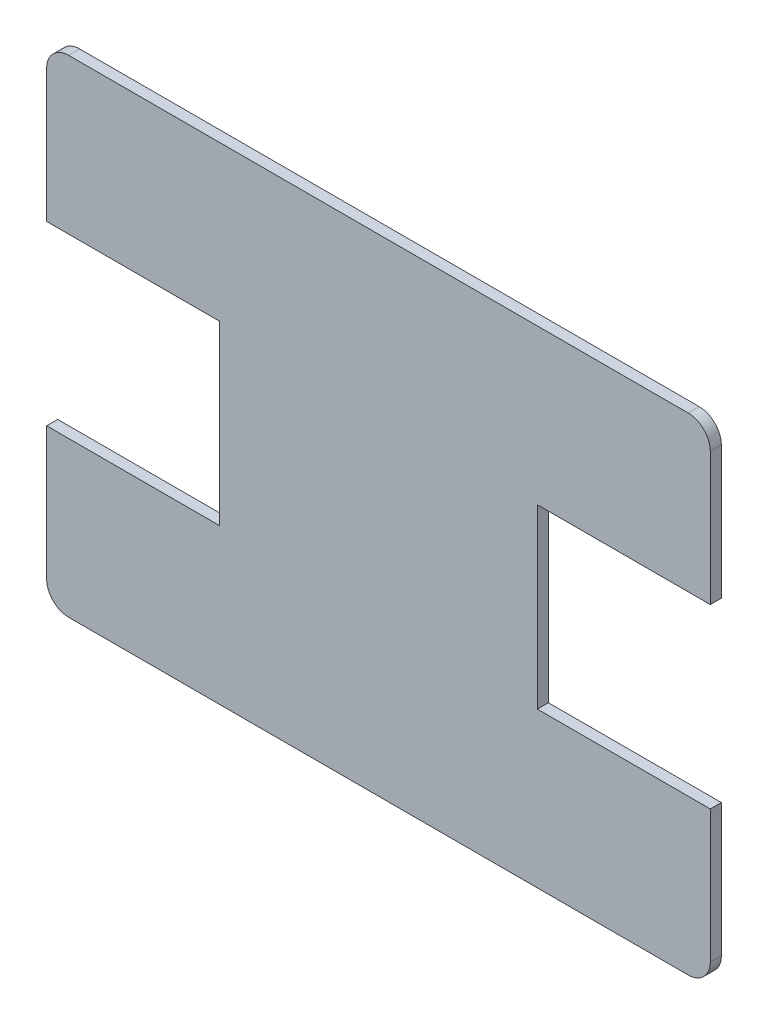
ISO-10303-21;
HEADER;
FILE_DESCRIPTION(('STEP AP214'),'2;1');
FILE_NAME('part.step','',(''),(''),'','','');
FILE_SCHEMA(('AUTOMOTIVE_DESIGN { 1 0 10303 214 1 1 1 1 }'));
ENDSEC;
DATA;
#1=APPLICATION_CONTEXT('core data for automotive mechanical design processes');
#2=APPLICATION_PROTOCOL_DEFINITION('international standard','automotive_design',2000,#1);
#3=PRODUCT_CONTEXT('',#1,'mechanical');
#4=PRODUCT('Part','Part','',(#3));
#5=PRODUCT_RELATED_PRODUCT_CATEGORY('part','',(#4));
#6=PRODUCT_DEFINITION_FORMATION('','',#4);
#7=PRODUCT_DEFINITION_CONTEXT('part definition',#1,'design');
#8=PRODUCT_DEFINITION('design','',#6,#7);
#9=PRODUCT_DEFINITION_SHAPE('','',#8);
#10=(LENGTH_UNIT() NAMED_UNIT(*) SI_UNIT(.MILLI.,.METRE.));
#11=(NAMED_UNIT(*) PLANE_ANGLE_UNIT() SI_UNIT($,.RADIAN.));
#12=(NAMED_UNIT(*) SI_UNIT($,.STERADIAN.) SOLID_ANGLE_UNIT());
#13=UNCERTAINTY_MEASURE_WITH_UNIT(LENGTH_MEASURE(1.E-05),#10,'distance_accuracy_value','');
#14=(GEOMETRIC_REPRESENTATION_CONTEXT(3) GLOBAL_UNCERTAINTY_ASSIGNED_CONTEXT((#13)) GLOBAL_UNIT_ASSIGNED_CONTEXT((#10,
#11,#12)) REPRESENTATION_CONTEXT('',''));
#15=CARTESIAN_POINT('',(0.,0.,0.));
#16=DIRECTION('',(0.,0.,1.));
#17=DIRECTION('',(1.,0.,0.));
#18=AXIS2_PLACEMENT_3D('',#15,#16,#17);
#19=CARTESIAN_POINT('',(-150.,99.9999999999999,5.));
#20=DIRECTION('',(1.,0.,0.));
#21=DIRECTION('',(0.,0.,-1.));
#22=AXIS2_PLACEMENT_3D('',#19,#20,#21);
#23=PLANE('',#22);
#24=DIRECTION('',(0.,-1.,0.));
#25=VECTOR('',#24,1.);
#26=CARTESIAN_POINT('',(-150.,99.9999999999999,0.));
#27=LINE('',#26,#25);
#28=CARTESIAN_POINT('',(-150.,99.9999999999999,0.));
#29=VERTEX_POINT('',#28);
#30=CARTESIAN_POINT('',(-150.,40.,0.));
#31=VERTEX_POINT('',#30);
#32=EDGE_CURVE('E179',#29,#31,#27,.T.);
#33=ORIENTED_EDGE('',*,*,#32,.T.);
#34=DIRECTION('',(0.,0.,-1.));
#35=VECTOR('',#34,1.);
#36=CARTESIAN_POINT('',(-150.,40.,5.));
#37=LINE('',#36,#35);
#38=CARTESIAN_POINT('',(-150.,40.,5.));
#39=VERTEX_POINT('',#38);
#40=EDGE_CURVE('E11',#39,#31,#37,.T.);
#41=ORIENTED_EDGE('',*,*,#40,.F.);
#42=DIRECTION('',(0.,-1.,0.));
#43=VECTOR('',#42,1.);
#44=CARTESIAN_POINT('',(-150.,99.9999999999999,5.));
#45=LINE('',#44,#43);
#46=CARTESIAN_POINT('',(-150.,99.9999999999999,5.));
#47=VERTEX_POINT('',#46);
#48=EDGE_CURVE('E209',#47,#39,#45,.T.);
#49=ORIENTED_EDGE('',*,*,#48,.F.);
#50=DIRECTION('',(0.,0.,-1.));
#51=VECTOR('',#50,1.);
#52=CARTESIAN_POINT('',(-150.,99.9999999999999,5.));
#53=LINE('',#52,#51);
#54=EDGE_CURVE('E175',#47,#29,#53,.T.);
#55=ORIENTED_EDGE('',*,*,#54,.T.);
#56=EDGE_LOOP('',(#33,#41,#49,#55));
#57=FACE_BOUND('',#56,.T.);
#58=ADVANCED_FACE('F35',(#57),#23,.F.);
#59=CARTESIAN_POINT('',(-150.,40.,5.));
#60=DIRECTION('',(0.,1.,0.));
#61=DIRECTION('',(-1.,0.,0.));
#62=AXIS2_PLACEMENT_3D('',#59,#60,#61);
#63=PLANE('',#62);
#64=DIRECTION('',(1.,0.,0.));
#65=VECTOR('',#64,1.);
#66=CARTESIAN_POINT('',(-150.,40.,0.));
#67=LINE('',#66,#65);
#68=CARTESIAN_POINT('',(-71.83,40.,0.));
#69=VERTEX_POINT('',#68);
#70=EDGE_CURVE('E182',#31,#69,#67,.T.);
#71=ORIENTED_EDGE('',*,*,#70,.T.);
#72=DIRECTION('',(0.,0.,-1.));
#73=VECTOR('',#72,1.);
#74=CARTESIAN_POINT('',(-71.83,40.,5.));
#75=LINE('',#74,#73);
#76=CARTESIAN_POINT('',(-71.83,40.,5.));
#77=VERTEX_POINT('',#76);
#78=EDGE_CURVE('E43',#77,#69,#75,.T.);
#79=ORIENTED_EDGE('',*,*,#78,.F.);
#80=DIRECTION('',(1.,0.,0.));
#81=VECTOR('',#80,1.);
#82=CARTESIAN_POINT('',(-150.,40.,5.));
#83=LINE('',#82,#81);
#84=EDGE_CURVE('E118',#39,#77,#83,.T.);
#85=ORIENTED_EDGE('',*,*,#84,.F.);
#86=ORIENTED_EDGE('',*,*,#40,.T.);
#87=EDGE_LOOP('',(#71,#79,#85,#86));
#88=FACE_BOUND('',#87,.T.);
#89=ADVANCED_FACE('F307',(#88),#63,.F.);
#90=CARTESIAN_POINT('',(-71.83,40.,5.));
#91=DIRECTION('',(1.,0.,0.));
#92=DIRECTION('',(0.,1.,0.));
#93=AXIS2_PLACEMENT_3D('',#90,#91,#92);
#94=PLANE('',#93);
#95=DIRECTION('',(0.,-1.,0.));
#96=VECTOR('',#95,1.);
#97=CARTESIAN_POINT('',(-71.83,40.,0.));
#98=LINE('',#97,#96);
#99=CARTESIAN_POINT('',(-71.83,-40.,0.));
#100=VERTEX_POINT('',#99);
#101=EDGE_CURVE('E184',#69,#100,#98,.T.);
#102=ORIENTED_EDGE('',*,*,#101,.T.);
#103=DIRECTION('',(0.,0.,-1.));
#104=VECTOR('',#103,1.);
#105=CARTESIAN_POINT('',(-71.83,-40.,5.));
#106=LINE('',#105,#104);
#107=CARTESIAN_POINT('',(-71.83,-40.,5.));
#108=VERTEX_POINT('',#107);
#109=EDGE_CURVE('E240',#108,#100,#106,.T.);
#110=ORIENTED_EDGE('',*,*,#109,.F.);
#111=DIRECTION('',(0.,-1.,0.));
#112=VECTOR('',#111,1.);
#113=CARTESIAN_POINT('',(-71.83,40.,5.));
#114=LINE('',#113,#112);
#115=EDGE_CURVE('E248',#77,#108,#114,.T.);
#116=ORIENTED_EDGE('',*,*,#115,.F.);
#117=ORIENTED_EDGE('',*,*,#78,.T.);
#118=EDGE_LOOP('',(#102,#110,#116,#117));
#119=FACE_BOUND('',#118,.T.);
#120=ADVANCED_FACE('F246',(#119),#94,.F.);
#121=CARTESIAN_POINT('',(-71.83,-40.,5.));
#122=DIRECTION('',(0.,-1.,0.));
#123=DIRECTION('',(1.,0.,0.));
#124=AXIS2_PLACEMENT_3D('',#121,#122,#123);
#125=PLANE('',#124);
#126=DIRECTION('',(-1.,0.,0.));
#127=VECTOR('',#126,1.);
#128=CARTESIAN_POINT('',(-71.83,-40.,0.));
#129=LINE('',#128,#127);
#130=CARTESIAN_POINT('',(-150.,-40.0000000000001,0.));
#131=VERTEX_POINT('',#130);
#132=EDGE_CURVE('E186',#100,#131,#129,.T.);
#133=ORIENTED_EDGE('',*,*,#132,.T.);
#134=DIRECTION('',(0.,0.,-1.));
#135=VECTOR('',#134,1.);
#136=CARTESIAN_POINT('',(-150.,-40.0000000000001,5.));
#137=LINE('',#136,#135);
#138=CARTESIAN_POINT('',(-150.,-40.0000000000001,5.));
#139=VERTEX_POINT('',#138);
#140=EDGE_CURVE('E237',#139,#131,#137,.T.);
#141=ORIENTED_EDGE('',*,*,#140,.F.);
#142=DIRECTION('',(-1.,0.,0.));
#143=VECTOR('',#142,1.);
#144=CARTESIAN_POINT('',(-71.83,-40.,5.));
#145=LINE('',#144,#143);
#146=EDGE_CURVE('E266',#108,#139,#145,.T.);
#147=ORIENTED_EDGE('',*,*,#146,.F.);
#148=ORIENTED_EDGE('',*,*,#109,.T.);
#149=EDGE_LOOP('',(#133,#141,#147,#148));
#150=FACE_BOUND('',#149,.T.);
#151=ADVANCED_FACE('F257',(#150),#125,.F.);
#152=CARTESIAN_POINT('',(-150.,-40.0000000000001,5.));
#153=DIRECTION('',(1.,0.,0.));
#154=DIRECTION('',(0.,1.,0.));
#155=AXIS2_PLACEMENT_3D('',#152,#153,#154);
#156=PLANE('',#155);
#157=DIRECTION('',(0.,-1.,0.));
#158=VECTOR('',#157,1.);
#159=CARTESIAN_POINT('',(-150.,-40.0000000000001,0.));
#160=LINE('',#159,#158);
#161=CARTESIAN_POINT('',(-150.,-100.,0.));
#162=VERTEX_POINT('',#161);
#163=EDGE_CURVE('E188',#131,#162,#160,.T.);
#164=ORIENTED_EDGE('',*,*,#163,.T.);
#165=DIRECTION('',(0.,0.,-1.));
#166=VECTOR('',#165,1.);
#167=CARTESIAN_POINT('',(-150.,-100.,5.));
#168=LINE('',#167,#166);
#169=CARTESIAN_POINT('',(-150.,-100.,5.));
#170=VERTEX_POINT('',#169);
#171=EDGE_CURVE('E234',#170,#162,#168,.T.);
#172=ORIENTED_EDGE('',*,*,#171,.F.);
#173=DIRECTION('',(0.,-1.,0.));
#174=VECTOR('',#173,1.);
#175=CARTESIAN_POINT('',(-150.,-40.0000000000001,5.));
#176=LINE('',#175,#174);
#177=EDGE_CURVE('E263',#139,#170,#176,.T.);
#178=ORIENTED_EDGE('',*,*,#177,.F.);
#179=ORIENTED_EDGE('',*,*,#140,.T.);
#180=EDGE_LOOP('',(#164,#172,#178,#179));
#181=FACE_BOUND('',#180,.T.);
#182=ADVANCED_FACE('F261',(#181),#156,.F.);
#183=CARTESIAN_POINT('',(-140.,-100.,5.));
#184=DIRECTION('',(0.,0.,-1.));
#185=DIRECTION('',(-1.,0.,0.));
#186=AXIS2_PLACEMENT_3D('',#183,#184,#185);
#187=CYLINDRICAL_SURFACE('',#186,10.);
#188=CARTESIAN_POINT('',(-140.,-100.,0.));
#189=DIRECTION('',(0.,0.,1.));
#190=DIRECTION('',(1.,0.,0.));
#191=AXIS2_PLACEMENT_3D('',#188,#189,#190);
#192=CIRCLE('',#191,10.);
#193=CARTESIAN_POINT('',(-140.,-110.,0.));
#194=VERTEX_POINT('',#193);
#195=EDGE_CURVE('E190',#162,#194,#192,.T.);
#196=ORIENTED_EDGE('',*,*,#195,.T.);
#197=DIRECTION('',(0.,0.,-1.));
#198=VECTOR('',#197,1.);
#199=CARTESIAN_POINT('',(-140.,-110.,5.));
#200=LINE('',#199,#198);
#201=CARTESIAN_POINT('',(-140.,-110.,5.));
#202=VERTEX_POINT('',#201);
#203=EDGE_CURVE('E231',#202,#194,#200,.T.);
#204=ORIENTED_EDGE('',*,*,#203,.F.);
#205=CARTESIAN_POINT('',(-140.,-100.,5.));
#206=DIRECTION('',(0.,0.,1.));
#207=DIRECTION('',(1.,0.,0.));
#208=AXIS2_PLACEMENT_3D('',#205,#206,#207);
#209=CIRCLE('',#208,10.);
#210=EDGE_CURVE('E265',#170,#202,#209,.T.);
#211=ORIENTED_EDGE('',*,*,#210,.F.);
#212=ORIENTED_EDGE('',*,*,#171,.T.);
#213=EDGE_LOOP('',(#196,#204,#211,#212));
#214=FACE_BOUND('',#213,.T.);
#215=ADVANCED_FACE('F320',(#214),#187,.T.);
#216=CARTESIAN_POINT('',(-140.,-110.,5.));
#217=DIRECTION('',(0.,1.,0.));
#218=DIRECTION('',(0.,0.,1.));
#219=AXIS2_PLACEMENT_3D('',#216,#217,#218);
#220=PLANE('',#219);
#221=DIRECTION('',(1.,0.,0.));
#222=VECTOR('',#221,1.);
#223=CARTESIAN_POINT('',(-140.,-110.,0.));
#224=LINE('',#223,#222);
#225=CARTESIAN_POINT('',(140.,-110.,0.));
#226=VERTEX_POINT('',#225);
#227=EDGE_CURVE('E192',#194,#226,#224,.T.);
#228=ORIENTED_EDGE('',*,*,#227,.T.);
#229=DIRECTION('',(0.,0.,-1.));
#230=VECTOR('',#229,1.);
#231=CARTESIAN_POINT('',(140.,-110.,5.));
#232=LINE('',#231,#230);
#233=CARTESIAN_POINT('',(140.,-110.,5.));
#234=VERTEX_POINT('',#233);
#235=EDGE_CURVE('E228',#234,#226,#232,.T.);
#236=ORIENTED_EDGE('',*,*,#235,.F.);
#237=DIRECTION('',(1.,0.,0.));
#238=VECTOR('',#237,1.);
#239=CARTESIAN_POINT('',(-140.,-110.,5.));
#240=LINE('',#239,#238);
#241=EDGE_CURVE('E268',#202,#234,#240,.T.);
#242=ORIENTED_EDGE('',*,*,#241,.F.);
#243=ORIENTED_EDGE('',*,*,#203,.T.);
#244=EDGE_LOOP('',(#228,#236,#242,#243));
#245=FACE_BOUND('',#244,.T.);
#246=ADVANCED_FACE('F323',(#245),#220,.F.);
#247=CARTESIAN_POINT('',(140.,-100.,5.));
#248=DIRECTION('',(0.,0.,-1.));
#249=DIRECTION('',(-1.,0.,0.));
#250=AXIS2_PLACEMENT_3D('',#247,#248,#249);
#251=CYLINDRICAL_SURFACE('',#250,10.);
#252=CARTESIAN_POINT('',(140.,-100.,0.));
#253=DIRECTION('',(0.,0.,1.));
#254=DIRECTION('',(1.,0.,0.));
#255=AXIS2_PLACEMENT_3D('',#252,#253,#254);
#256=CIRCLE('',#255,10.);
#257=CARTESIAN_POINT('',(150.,-100.,0.));
#258=VERTEX_POINT('',#257);
#259=EDGE_CURVE('E194',#226,#258,#256,.T.);
#260=ORIENTED_EDGE('',*,*,#259,.T.);
#261=DIRECTION('',(0.,0.,-1.));
#262=VECTOR('',#261,1.);
#263=CARTESIAN_POINT('',(150.,-100.,5.));
#264=LINE('',#263,#262);
#265=CARTESIAN_POINT('',(150.,-100.,5.));
#266=VERTEX_POINT('',#265);
#267=EDGE_CURVE('E225',#266,#258,#264,.T.);
#268=ORIENTED_EDGE('',*,*,#267,.F.);
#269=CARTESIAN_POINT('',(140.,-100.,5.));
#270=DIRECTION('',(0.,0.,1.));
#271=DIRECTION('',(1.,0.,0.));
#272=AXIS2_PLACEMENT_3D('',#269,#270,#271);
#273=CIRCLE('',#272,10.);
#274=EDGE_CURVE('E274',#234,#266,#273,.T.);
#275=ORIENTED_EDGE('',*,*,#274,.F.);
#276=ORIENTED_EDGE('',*,*,#235,.T.);
#277=EDGE_LOOP('',(#260,#268,#275,#276));
#278=FACE_BOUND('',#277,.T.);
#279=ADVANCED_FACE('F327',(#278),#251,.T.);
#280=CARTESIAN_POINT('',(150.,-39.9999999999999,5.));
#281=DIRECTION('',(-1.,0.,0.));
#282=DIRECTION('',(0.,0.,1.));
#283=AXIS2_PLACEMENT_3D('',#280,#281,#282);
#284=PLANE('',#283);
#285=DIRECTION('',(0.,1.,0.));
#286=VECTOR('',#285,1.);
#287=CARTESIAN_POINT('',(150.,-39.9999999999999,0.));
#288=LINE('',#287,#286);
#289=CARTESIAN_POINT('',(150.,-39.9999999999999,0.));
#290=VERTEX_POINT('',#289);
#291=EDGE_CURVE('E196',#258,#290,#288,.T.);
#292=ORIENTED_EDGE('',*,*,#291,.T.);
#293=DIRECTION('',(0.,0.,-1.));
#294=VECTOR('',#293,1.);
#295=CARTESIAN_POINT('',(150.,-39.9999999999999,5.));
#296=LINE('',#295,#294);
#297=CARTESIAN_POINT('',(150.,-39.9999999999999,5.));
#298=VERTEX_POINT('',#297);
#299=EDGE_CURVE('E222',#298,#290,#296,.T.);
#300=ORIENTED_EDGE('',*,*,#299,.F.);
#301=DIRECTION('',(0.,1.,0.));
#302=VECTOR('',#301,1.);
#303=CARTESIAN_POINT('',(150.,-39.9999999999999,5.));
#304=LINE('',#303,#302);
#305=EDGE_CURVE('E276',#266,#298,#304,.T.);
#306=ORIENTED_EDGE('',*,*,#305,.F.);
#307=ORIENTED_EDGE('',*,*,#267,.T.);
#308=EDGE_LOOP('',(#292,#300,#306,#307));
#309=FACE_BOUND('',#308,.T.);
#310=ADVANCED_FACE('F331',(#309),#284,.F.);
#311=CARTESIAN_POINT('',(71.83,-40.,5.));
#312=DIRECTION('',(0.,-1.,0.));
#313=DIRECTION('',(1.,0.,0.));
#314=AXIS2_PLACEMENT_3D('',#311,#312,#313);
#315=PLANE('',#314);
#316=DIRECTION('',(-1.,0.,0.));
#317=VECTOR('',#316,1.);
#318=CARTESIAN_POINT('',(71.83,-40.,0.));
#319=LINE('',#318,#317);
#320=CARTESIAN_POINT('',(71.83,-40.,0.));
#321=VERTEX_POINT('',#320);
#322=EDGE_CURVE('E198',#290,#321,#319,.T.);
#323=ORIENTED_EDGE('',*,*,#322,.T.);
#324=DIRECTION('',(0.,0.,-1.));
#325=VECTOR('',#324,1.);
#326=CARTESIAN_POINT('',(71.83,-40.,5.));
#327=LINE('',#326,#325);
#328=CARTESIAN_POINT('',(71.83,-40.,5.));
#329=VERTEX_POINT('',#328);
#330=EDGE_CURVE('E219',#329,#321,#327,.T.);
#331=ORIENTED_EDGE('',*,*,#330,.F.);
#332=DIRECTION('',(-1.,0.,0.));
#333=VECTOR('',#332,1.);
#334=CARTESIAN_POINT('',(71.83,-40.,5.));
#335=LINE('',#334,#333);
#336=EDGE_CURVE('E278',#298,#329,#335,.T.);
#337=ORIENTED_EDGE('',*,*,#336,.F.);
#338=ORIENTED_EDGE('',*,*,#299,.T.);
#339=EDGE_LOOP('',(#323,#331,#337,#338));
#340=FACE_BOUND('',#339,.T.);
#341=ADVANCED_FACE('F335',(#340),#315,.F.);
#342=CARTESIAN_POINT('',(71.8299999999999,40.,5.));
#343=DIRECTION('',(-1.,0.,0.));
#344=DIRECTION('',(0.,-1.,0.));
#345=AXIS2_PLACEMENT_3D('',#342,#343,#344);
#346=PLANE('',#345);
#347=DIRECTION('',(0.,1.,0.));
#348=VECTOR('',#347,1.);
#349=CARTESIAN_POINT('',(71.8299999999999,40.,0.));
#350=LINE('',#349,#348);
#351=CARTESIAN_POINT('',(71.8299999999999,40.,0.));
#352=VERTEX_POINT('',#351);
#353=EDGE_CURVE('E200',#321,#352,#350,.T.);
#354=ORIENTED_EDGE('',*,*,#353,.T.);
#355=DIRECTION('',(0.,0.,-1.));
#356=VECTOR('',#355,1.);
#357=CARTESIAN_POINT('',(71.8299999999999,40.,5.));
#358=LINE('',#357,#356);
#359=CARTESIAN_POINT('',(71.8299999999999,40.,5.));
#360=VERTEX_POINT('',#359);
#361=EDGE_CURVE('E216',#360,#352,#358,.T.);
#362=ORIENTED_EDGE('',*,*,#361,.F.);
#363=DIRECTION('',(0.,1.,0.));
#364=VECTOR('',#363,1.);
#365=CARTESIAN_POINT('',(71.8299999999999,40.,5.));
#366=LINE('',#365,#364);
#367=EDGE_CURVE('E280',#329,#360,#366,.T.);
#368=ORIENTED_EDGE('',*,*,#367,.F.);
#369=ORIENTED_EDGE('',*,*,#330,.T.);
#370=EDGE_LOOP('',(#354,#362,#368,#369));
#371=FACE_BOUND('',#370,.T.);
#372=ADVANCED_FACE('F339',(#371),#346,.F.);
#373=CARTESIAN_POINT('',(150.,40.,5.));
#374=DIRECTION('',(0.,1.,0.));
#375=DIRECTION('',(0.,0.,1.));
#376=AXIS2_PLACEMENT_3D('',#373,#374,#375);
#377=PLANE('',#376);
#378=DIRECTION('',(1.,0.,0.));
#379=VECTOR('',#378,1.);
#380=CARTESIAN_POINT('',(150.,40.,0.));
#381=LINE('',#380,#379);
#382=CARTESIAN_POINT('',(150.,40.,0.));
#383=VERTEX_POINT('',#382);
#384=EDGE_CURVE('E202',#352,#383,#381,.T.);
#385=ORIENTED_EDGE('',*,*,#384,.T.);
#386=DIRECTION('',(0.,0.,-1.));
#387=VECTOR('',#386,1.);
#388=CARTESIAN_POINT('',(150.,40.,5.));
#389=LINE('',#388,#387);
#390=CARTESIAN_POINT('',(150.,40.,5.));
#391=VERTEX_POINT('',#390);
#392=EDGE_CURVE('E213',#391,#383,#389,.T.);
#393=ORIENTED_EDGE('',*,*,#392,.F.);
#394=DIRECTION('',(1.,0.,0.));
#395=VECTOR('',#394,1.);
#396=CARTESIAN_POINT('',(150.,40.,5.));
#397=LINE('',#396,#395);
#398=EDGE_CURVE('E282',#360,#391,#397,.T.);
#399=ORIENTED_EDGE('',*,*,#398,.F.);
#400=ORIENTED_EDGE('',*,*,#361,.T.);
#401=EDGE_LOOP('',(#385,#393,#399,#400));
#402=FACE_BOUND('',#401,.T.);
#403=ADVANCED_FACE('F288',(#402),#377,.F.);
#404=CARTESIAN_POINT('',(150.,99.9999999999999,5.));
#405=DIRECTION('',(-1.,0.,0.));
#406=DIRECTION('',(0.,0.,1.));
#407=AXIS2_PLACEMENT_3D('',#404,#405,#406);
#408=PLANE('',#407);
#409=DIRECTION('',(0.,1.,0.));
#410=VECTOR('',#409,1.);
#411=CARTESIAN_POINT('',(150.,99.9999999999999,0.));
#412=LINE('',#411,#410);
#413=CARTESIAN_POINT('',(150.,99.9999999999999,0.));
#414=VERTEX_POINT('',#413);
#415=EDGE_CURVE('E204',#383,#414,#412,.T.);
#416=ORIENTED_EDGE('',*,*,#415,.T.);
#417=DIRECTION('',(0.,0.,-1.));
#418=VECTOR('',#417,1.);
#419=CARTESIAN_POINT('',(150.,99.9999999999999,5.));
#420=LINE('',#419,#418);
#421=CARTESIAN_POINT('',(150.,99.9999999999999,5.));
#422=VERTEX_POINT('',#421);
#423=EDGE_CURVE('E170',#422,#414,#420,.T.);
#424=ORIENTED_EDGE('',*,*,#423,.F.);
#425=DIRECTION('',(0.,1.,0.));
#426=VECTOR('',#425,1.);
#427=CARTESIAN_POINT('',(150.,99.9999999999999,5.));
#428=LINE('',#427,#426);
#429=EDGE_CURVE('E161',#391,#422,#428,.T.);
#430=ORIENTED_EDGE('',*,*,#429,.F.);
#431=ORIENTED_EDGE('',*,*,#392,.T.);
#432=EDGE_LOOP('',(#416,#424,#430,#431));
#433=FACE_BOUND('',#432,.T.);
#434=ADVANCED_FACE('F292',(#433),#408,.F.);
#435=CARTESIAN_POINT('',(140.,100.,5.));
#436=DIRECTION('',(0.,0.,-1.));
#437=DIRECTION('',(-1.,0.,0.));
#438=AXIS2_PLACEMENT_3D('',#435,#436,#437);
#439=CYLINDRICAL_SURFACE('',#438,10.);
#440=CARTESIAN_POINT('',(140.,100.,0.));
#441=DIRECTION('',(0.,0.,1.));
#442=DIRECTION('',(-1.,0.,0.));
#443=AXIS2_PLACEMENT_3D('',#440,#441,#442);
#444=CIRCLE('',#443,10.);
#445=CARTESIAN_POINT('',(140.,110.,0.));
#446=VERTEX_POINT('',#445);
#447=EDGE_CURVE('E169',#414,#446,#444,.T.);
#448=ORIENTED_EDGE('',*,*,#447,.T.);
#449=DIRECTION('',(0.,0.,-1.));
#450=VECTOR('',#449,1.);
#451=CARTESIAN_POINT('',(140.,110.,5.));
#452=LINE('',#451,#450);
#453=CARTESIAN_POINT('',(140.,110.,5.));
#454=VERTEX_POINT('',#453);
#455=EDGE_CURVE('E166',#454,#446,#452,.T.);
#456=ORIENTED_EDGE('',*,*,#455,.F.);
#457=CARTESIAN_POINT('',(140.,100.,5.));
#458=DIRECTION('',(0.,0.,1.));
#459=DIRECTION('',(-1.,0.,0.));
#460=AXIS2_PLACEMENT_3D('',#457,#458,#459);
#461=CIRCLE('',#460,10.);
#462=EDGE_CURVE('E155',#422,#454,#461,.T.);
#463=ORIENTED_EDGE('',*,*,#462,.F.);
#464=ORIENTED_EDGE('',*,*,#423,.T.);
#465=EDGE_LOOP('',(#448,#456,#463,#464));
#466=FACE_BOUND('',#465,.T.);
#467=ADVANCED_FACE('F167',(#466),#439,.T.);
#468=CARTESIAN_POINT('',(-140.,110.,5.));
#469=DIRECTION('',(0.,-1.,0.));
#470=DIRECTION('',(0.,0.,-1.));
#471=AXIS2_PLACEMENT_3D('',#468,#469,#470);
#472=PLANE('',#471);
#473=DIRECTION('',(-1.,0.,0.));
#474=VECTOR('',#473,1.);
#475=CARTESIAN_POINT('',(-140.,110.,0.));
#476=LINE('',#475,#474);
#477=CARTESIAN_POINT('',(-140.,110.,0.));
#478=VERTEX_POINT('',#477);
#479=EDGE_CURVE('E104',#446,#478,#476,.T.);
#480=ORIENTED_EDGE('',*,*,#479,.T.);
#481=DIRECTION('',(0.,0.,-1.));
#482=VECTOR('',#481,1.);
#483=CARTESIAN_POINT('',(-140.,110.,5.));
#484=LINE('',#483,#482);
#485=CARTESIAN_POINT('',(-140.,110.,5.));
#486=VERTEX_POINT('',#485);
#487=EDGE_CURVE('E171',#486,#478,#484,.T.);
#488=ORIENTED_EDGE('',*,*,#487,.F.);
#489=DIRECTION('',(-1.,0.,0.));
#490=VECTOR('',#489,1.);
#491=CARTESIAN_POINT('',(-140.,110.,5.));
#492=LINE('',#491,#490);
#493=EDGE_CURVE('E159',#454,#486,#492,.T.);
#494=ORIENTED_EDGE('',*,*,#493,.F.);
#495=ORIENTED_EDGE('',*,*,#455,.T.);
#496=EDGE_LOOP('',(#480,#488,#494,#495));
#497=FACE_BOUND('',#496,.T.);
#498=ADVANCED_FACE('F173',(#497),#472,.F.);
#499=CARTESIAN_POINT('',(-140.,100.,5.));
#500=DIRECTION('',(0.,0.,-1.));
#501=DIRECTION('',(-1.,0.,0.));
#502=AXIS2_PLACEMENT_3D('',#499,#500,#501);
#503=CYLINDRICAL_SURFACE('',#502,10.);
#504=CARTESIAN_POINT('',(-140.,100.,0.));
#505=DIRECTION('',(0.,0.,1.));
#506=DIRECTION('',(1.,0.,0.));
#507=AXIS2_PLACEMENT_3D('',#504,#505,#506);
#508=CIRCLE('',#507,10.);
#509=EDGE_CURVE('E110',#478,#29,#508,.T.);
#510=ORIENTED_EDGE('',*,*,#509,.T.);
#511=ORIENTED_EDGE('',*,*,#54,.F.);
#512=CARTESIAN_POINT('',(-140.,100.,5.));
#513=DIRECTION('',(0.,0.,1.));
#514=DIRECTION('',(1.,0.,0.));
#515=AXIS2_PLACEMENT_3D('',#512,#513,#514);
#516=CIRCLE('',#515,10.);
#517=EDGE_CURVE('E51',#486,#47,#516,.T.);
#518=ORIENTED_EDGE('',*,*,#517,.F.);
#519=ORIENTED_EDGE('',*,*,#487,.T.);
#520=EDGE_LOOP('',(#510,#511,#518,#519));
#521=FACE_BOUND('',#520,.T.);
#522=ADVANCED_FACE('F296',(#521),#503,.T.);
#523=CARTESIAN_POINT('',(-140.,-100.,5.));
#524=DIRECTION('',(0.,0.,1.));
#525=DIRECTION('',(1.,0.,0.));
#526=AXIS2_PLACEMENT_3D('',#523,#524,#525);
#527=PLANE('',#526);
#528=ORIENTED_EDGE('',*,*,#48,.T.);
#529=ORIENTED_EDGE('',*,*,#84,.T.);
#530=ORIENTED_EDGE('',*,*,#115,.T.);
#531=ORIENTED_EDGE('',*,*,#146,.T.);
#532=ORIENTED_EDGE('',*,*,#177,.T.);
#533=ORIENTED_EDGE('',*,*,#210,.T.);
#534=ORIENTED_EDGE('',*,*,#241,.T.);
#535=ORIENTED_EDGE('',*,*,#274,.T.);
#536=ORIENTED_EDGE('',*,*,#305,.T.);
#537=ORIENTED_EDGE('',*,*,#336,.T.);
#538=ORIENTED_EDGE('',*,*,#367,.T.);
#539=ORIENTED_EDGE('',*,*,#398,.T.);
#540=ORIENTED_EDGE('',*,*,#429,.T.);
#541=ORIENTED_EDGE('',*,*,#462,.T.);
#542=ORIENTED_EDGE('',*,*,#493,.T.);
#543=ORIENTED_EDGE('',*,*,#517,.T.);
#544=EDGE_LOOP('',(#528,#529,#530,#531,#532,#533,#534,#535,#536,#537,#538,#539,#540,#541,#542,#543));
#545=FACE_BOUND('',#544,.T.);
#546=ADVANCED_FACE('F157',(#545),#527,.T.);
#547=CARTESIAN_POINT('',(-140.,-100.,0.));
#548=DIRECTION('',(0.,0.,1.));
#549=DIRECTION('',(1.,0.,0.));
#550=AXIS2_PLACEMENT_3D('',#547,#548,#549);
#551=PLANE('',#550);
#552=ORIENTED_EDGE('',*,*,#32,.F.);
#553=ORIENTED_EDGE('',*,*,#509,.F.);
#554=ORIENTED_EDGE('',*,*,#479,.F.);
#555=ORIENTED_EDGE('',*,*,#447,.F.);
#556=ORIENTED_EDGE('',*,*,#415,.F.);
#557=ORIENTED_EDGE('',*,*,#384,.F.);
#558=ORIENTED_EDGE('',*,*,#353,.F.);
#559=ORIENTED_EDGE('',*,*,#322,.F.);
#560=ORIENTED_EDGE('',*,*,#291,.F.);
#561=ORIENTED_EDGE('',*,*,#259,.F.);
#562=ORIENTED_EDGE('',*,*,#227,.F.);
#563=ORIENTED_EDGE('',*,*,#195,.F.);
#564=ORIENTED_EDGE('',*,*,#163,.F.);
#565=ORIENTED_EDGE('',*,*,#132,.F.);
#566=ORIENTED_EDGE('',*,*,#101,.F.);
#567=ORIENTED_EDGE('',*,*,#70,.F.);
#568=EDGE_LOOP('',(#552,#553,#554,#555,#556,#557,#558,#559,#560,#561,#562,#563,#564,#565,#566,#567));
#569=FACE_BOUND('',#568,.T.);
#570=ADVANCED_FACE('F252',(#569),#551,.F.);
#571=CLOSED_SHELL('',(#58,#89,#120,#151,#182,#215,#246,#279,#310,#341,#372,#403,#434,#467,#498,
#522,#546,#570));
#572=MANIFOLD_SOLID_BREP('B2',#571);
#573=ADVANCED_BREP_SHAPE_REPRESENTATION('',(#18,#572),#14);
#574=SHAPE_DEFINITION_REPRESENTATION(#9,#573);
ENDSEC;
END-ISO-10303-21;
